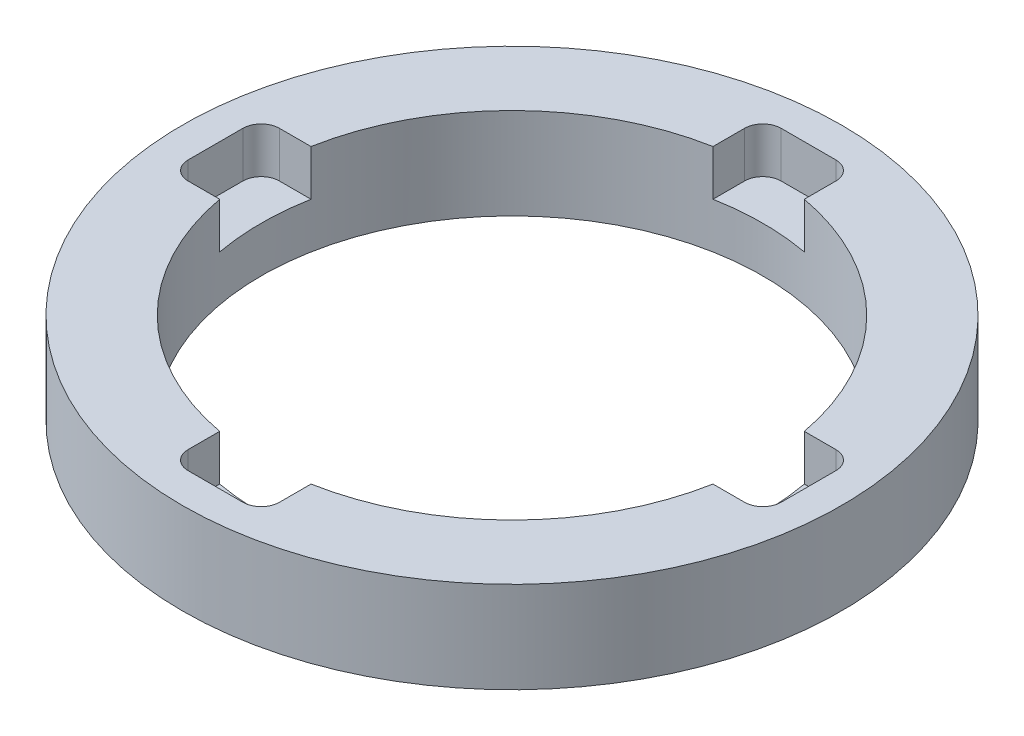
ISO-10303-21;
HEADER;
FILE_DESCRIPTION(('STEP AP214'),'2;1');
FILE_NAME('part.step','',(''),(''),'','','');
FILE_SCHEMA(('AUTOMOTIVE_DESIGN { 1 0 10303 214 1 1 1 1 }'));
ENDSEC;
DATA;
#1=APPLICATION_CONTEXT('core data for automotive mechanical design processes');
#2=APPLICATION_PROTOCOL_DEFINITION('international standard','automotive_design',2000,#1);
#3=PRODUCT_CONTEXT('',#1,'mechanical');
#4=PRODUCT('Part','Part','',(#3));
#5=PRODUCT_RELATED_PRODUCT_CATEGORY('part','',(#4));
#6=PRODUCT_DEFINITION_FORMATION('','',#4);
#7=PRODUCT_DEFINITION_CONTEXT('part definition',#1,'design');
#8=PRODUCT_DEFINITION('design','',#6,#7);
#9=PRODUCT_DEFINITION_SHAPE('','',#8);
#10=(LENGTH_UNIT() NAMED_UNIT(*) SI_UNIT(.MILLI.,.METRE.));
#11=(NAMED_UNIT(*) PLANE_ANGLE_UNIT() SI_UNIT($,.RADIAN.));
#12=(NAMED_UNIT(*) SI_UNIT($,.STERADIAN.) SOLID_ANGLE_UNIT());
#13=UNCERTAINTY_MEASURE_WITH_UNIT(LENGTH_MEASURE(1.E-05),#10,'distance_accuracy_value','');
#14=(GEOMETRIC_REPRESENTATION_CONTEXT(3) GLOBAL_UNCERTAINTY_ASSIGNED_CONTEXT((#13)) GLOBAL_UNIT_ASSIGNED_CONTEXT((#10,
#11,#12)) REPRESENTATION_CONTEXT('',''));
#15=CARTESIAN_POINT('',(0.,0.,0.));
#16=DIRECTION('',(0.,0.,1.));
#17=DIRECTION('',(1.,0.,0.));
#18=AXIS2_PLACEMENT_3D('',#15,#16,#17);
#19=CARTESIAN_POINT('',(0.,12.7,0.));
#20=DIRECTION('',(0.,1.,0.));
#21=DIRECTION('',(0.,0.,1.));
#22=AXIS2_PLACEMENT_3D('',#19,#20,#21);
#23=PLANE('',#22);
#24=DIRECTION('',(0.,0.,-1.));
#25=VECTOR('',#24,1.);
#26=CARTESIAN_POINT('',(6.35,12.7,34.3041293667395));
#27=LINE('',#26,#25);
#28=CARTESIAN_POINT('',(6.35,12.7,38.6969));
#29=VERTEX_POINT('',#28);
#30=CARTESIAN_POINT('',(6.35,12.7,34.3041293667395));
#31=VERTEX_POINT('',#30);
#32=EDGE_CURVE('E217',#29,#31,#27,.T.);
#33=ORIENTED_EDGE('',*,*,#32,.F.);
#34=CARTESIAN_POINT('',(3.81,12.7,38.6969));
#35=DIRECTION('',(0.,1.,0.));
#36=DIRECTION('',(0.,0.,-1.));
#37=AXIS2_PLACEMENT_3D('',#34,#35,#36);
#38=CIRCLE('',#37,2.54);
#39=CARTESIAN_POINT('',(3.80999999999998,12.7,41.2369));
#40=VERTEX_POINT('',#39);
#41=EDGE_CURVE('E436',#40,#29,#38,.T.);
#42=ORIENTED_EDGE('',*,*,#41,.F.);
#43=DIRECTION('',(1.,0.,0.));
#44=VECTOR('',#43,1.);
#45=CARTESIAN_POINT('',(-3.80999999999998,12.7,41.2369));
#46=LINE('',#45,#44);
#47=CARTESIAN_POINT('',(-3.80999999999998,12.7,41.2369));
#48=VERTEX_POINT('',#47);
#49=EDGE_CURVE('E430',#48,#40,#46,.T.);
#50=ORIENTED_EDGE('',*,*,#49,.F.);
#51=CARTESIAN_POINT('',(-3.81,12.7,38.6969));
#52=DIRECTION('',(0.,1.,0.));
#53=DIRECTION('',(0.,0.,-1.));
#54=AXIS2_PLACEMENT_3D('',#51,#52,#53);
#55=CIRCLE('',#54,2.54);
#56=CARTESIAN_POINT('',(-6.35,12.7,38.6969));
#57=VERTEX_POINT('',#56);
#58=EDGE_CURVE('E428',#57,#48,#55,.T.);
#59=ORIENTED_EDGE('',*,*,#58,.F.);
#60=DIRECTION('',(0.,0.,1.));
#61=VECTOR('',#60,1.);
#62=CARTESIAN_POINT('',(-6.35,12.7,34.3041293667395));
#63=LINE('',#62,#61);
#64=CARTESIAN_POINT('',(-6.35,12.7,34.3041293667395));
#65=VERTEX_POINT('',#64);
#66=EDGE_CURVE('E264',#65,#57,#63,.T.);
#67=ORIENTED_EDGE('',*,*,#66,.F.);
#68=CARTESIAN_POINT('',(0.,12.7,0.));
#69=DIRECTION('',(0.,1.,0.));
#70=DIRECTION('',(0.,0.,1.));
#71=AXIS2_PLACEMENT_3D('',#68,#69,#70);
#72=CIRCLE('',#71,34.8869);
#73=CARTESIAN_POINT('',(-34.3041293667395,12.7,6.35000000000012));
#74=VERTEX_POINT('',#73);
#75=EDGE_CURVE('E224',#74,#65,#72,.T.);
#76=ORIENTED_EDGE('',*,*,#75,.F.);
#77=DIRECTION('',(1.,0.,0.));
#78=VECTOR('',#77,1.);
#79=CARTESIAN_POINT('',(-34.3041293667395,12.7,6.35000000000012));
#80=LINE('',#79,#78);
#81=CARTESIAN_POINT('',(-38.6969,12.7,6.35000000000014));
#82=VERTEX_POINT('',#81);
#83=EDGE_CURVE('E278',#82,#74,#80,.T.);
#84=ORIENTED_EDGE('',*,*,#83,.F.);
#85=CARTESIAN_POINT('',(-38.6969,12.7,3.81000000000014));
#86=DIRECTION('',(0.,1.,0.));
#87=DIRECTION('',(1.,0.,0.));
#88=AXIS2_PLACEMENT_3D('',#85,#86,#87);
#89=CIRCLE('',#88,2.54);
#90=CARTESIAN_POINT('',(-41.2369,12.7,3.81000000000013));
#91=VERTEX_POINT('',#90);
#92=EDGE_CURVE('E303',#91,#82,#89,.T.);
#93=ORIENTED_EDGE('',*,*,#92,.F.);
#94=DIRECTION('',(0.,0.,1.));
#95=VECTOR('',#94,1.);
#96=CARTESIAN_POINT('',(-41.2369,12.7,-3.80999999999984));
#97=LINE('',#96,#95);
#98=CARTESIAN_POINT('',(-41.2369,12.7,-3.80999999999984));
#99=VERTEX_POINT('',#98);
#100=EDGE_CURVE('E300',#99,#91,#97,.T.);
#101=ORIENTED_EDGE('',*,*,#100,.F.);
#102=CARTESIAN_POINT('',(-38.6969,12.7,-3.80999999999987));
#103=DIRECTION('',(0.,1.,0.));
#104=DIRECTION('',(1.,0.,0.));
#105=AXIS2_PLACEMENT_3D('',#102,#103,#104);
#106=CIRCLE('',#105,2.54);
#107=CARTESIAN_POINT('',(-38.6969,12.7,-6.34999999999986));
#108=VERTEX_POINT('',#107);
#109=EDGE_CURVE('E296',#108,#99,#106,.T.);
#110=ORIENTED_EDGE('',*,*,#109,.F.);
#111=DIRECTION('',(-1.,0.,0.));
#112=VECTOR('',#111,1.);
#113=CARTESIAN_POINT('',(-34.3041293667395,12.7,-6.34999999999988));
#114=LINE('',#113,#112);
#115=CARTESIAN_POINT('',(-34.3041293667395,12.7,-6.34999999999988));
#116=VERTEX_POINT('',#115);
#117=EDGE_CURVE('E293',#116,#108,#114,.T.);
#118=ORIENTED_EDGE('',*,*,#117,.F.);
#119=CARTESIAN_POINT('',(-6.35,12.7,-34.3041293667395));
#120=VERTEX_POINT('',#119);
#121=EDGE_CURVE('E364',#120,#116,#72,.T.);
#122=ORIENTED_EDGE('',*,*,#121,.F.);
#123=DIRECTION('',(0.,0.,1.));
#124=VECTOR('',#123,1.);
#125=CARTESIAN_POINT('',(-6.35,12.7,-34.3041293667395));
#126=LINE('',#125,#124);
#127=CARTESIAN_POINT('',(-6.35,12.7,-38.6969));
#128=VERTEX_POINT('',#127);
#129=EDGE_CURVE('E323',#128,#120,#126,.T.);
#130=ORIENTED_EDGE('',*,*,#129,.F.);
#131=CARTESIAN_POINT('',(-3.81,12.7,-38.6969));
#132=DIRECTION('',(0.,1.,0.));
#133=DIRECTION('',(0.,0.,1.));
#134=AXIS2_PLACEMENT_3D('',#131,#132,#133);
#135=CIRCLE('',#134,2.54);
#136=CARTESIAN_POINT('',(-3.80999999999998,12.7,-41.2369));
#137=VERTEX_POINT('',#136);
#138=EDGE_CURVE('E346',#137,#128,#135,.T.);
#139=ORIENTED_EDGE('',*,*,#138,.F.);
#140=DIRECTION('',(-1.,0.,0.));
#141=VECTOR('',#140,1.);
#142=CARTESIAN_POINT('',(3.80999999999998,12.7,-41.2369));
#143=LINE('',#142,#141);
#144=CARTESIAN_POINT('',(3.80999999999998,12.7,-41.2369));
#145=VERTEX_POINT('',#144);
#146=EDGE_CURVE('E343',#145,#137,#143,.T.);
#147=ORIENTED_EDGE('',*,*,#146,.F.);
#148=CARTESIAN_POINT('',(3.81,12.7,-38.6969));
#149=DIRECTION('',(0.,1.,0.));
#150=DIRECTION('',(0.,0.,1.));
#151=AXIS2_PLACEMENT_3D('',#148,#149,#150);
#152=CIRCLE('',#151,2.54);
#153=CARTESIAN_POINT('',(6.35,12.7,-38.6969));
#154=VERTEX_POINT('',#153);
#155=EDGE_CURVE('E340',#154,#145,#152,.T.);
#156=ORIENTED_EDGE('',*,*,#155,.F.);
#157=DIRECTION('',(0.,0.,-1.));
#158=VECTOR('',#157,1.);
#159=CARTESIAN_POINT('',(6.35,12.7,-34.3041293667395));
#160=LINE('',#159,#158);
#161=CARTESIAN_POINT('',(6.35,12.7,-34.3041293667395));
#162=VERTEX_POINT('',#161);
#163=EDGE_CURVE('E309',#162,#154,#160,.T.);
#164=ORIENTED_EDGE('',*,*,#163,.F.);
#165=CARTESIAN_POINT('',(34.3041293667394,12.7,-6.35000000000036));
#166=VERTEX_POINT('',#165);
#167=EDGE_CURVE('E367',#166,#162,#72,.T.);
#168=ORIENTED_EDGE('',*,*,#167,.F.);
#169=DIRECTION('',(-1.,0.,0.));
#170=VECTOR('',#169,1.);
#171=CARTESIAN_POINT('',(34.3041293667394,12.7,-6.35000000000036));
#172=LINE('',#171,#170);
#173=CARTESIAN_POINT('',(38.6968999999999,12.7,-6.35000000000041));
#174=VERTEX_POINT('',#173);
#175=EDGE_CURVE('E235',#174,#166,#172,.T.);
#176=ORIENTED_EDGE('',*,*,#175,.F.);
#177=CARTESIAN_POINT('',(38.6969,12.7,-3.81000000000041));
#178=DIRECTION('',(0.,1.,0.));
#179=DIRECTION('',(-1.,0.,0.));
#180=AXIS2_PLACEMENT_3D('',#177,#178,#179);
#181=CIRCLE('',#180,2.54);
#182=CARTESIAN_POINT('',(41.2369,12.7,-3.81000000000041));
#183=VERTEX_POINT('',#182);
#184=EDGE_CURVE('E257',#183,#174,#181,.T.);
#185=ORIENTED_EDGE('',*,*,#184,.F.);
#186=DIRECTION('',(0.,0.,-1.));
#187=VECTOR('',#186,1.);
#188=CARTESIAN_POINT('',(41.2369,12.7,3.80999999999955));
#189=LINE('',#188,#187);
#190=CARTESIAN_POINT('',(41.2369,12.7,3.80999999999955));
#191=VERTEX_POINT('',#190);
#192=EDGE_CURVE('E254',#191,#183,#189,.T.);
#193=ORIENTED_EDGE('',*,*,#192,.F.);
#194=CARTESIAN_POINT('',(38.6969,12.7,3.8099999999996));
#195=DIRECTION('',(0.,1.,0.));
#196=DIRECTION('',(-1.,0.,0.));
#197=AXIS2_PLACEMENT_3D('',#194,#195,#196);
#198=CIRCLE('',#197,2.54);
#199=CARTESIAN_POINT('',(38.6969000000001,12.7,6.34999999999959));
#200=VERTEX_POINT('',#199);
#201=EDGE_CURVE('E251',#200,#191,#198,.T.);
#202=ORIENTED_EDGE('',*,*,#201,.F.);
#203=DIRECTION('',(1.,0.,0.));
#204=VECTOR('',#203,1.);
#205=CARTESIAN_POINT('',(34.3041293667396,12.7,6.34999999999964));
#206=LINE('',#205,#204);
#207=CARTESIAN_POINT('',(34.3041293667396,12.7,6.34999999999964));
#208=VERTEX_POINT('',#207);
#209=EDGE_CURVE('E248',#208,#200,#206,.T.);
#210=ORIENTED_EDGE('',*,*,#209,.F.);
#211=EDGE_CURVE('E371',#31,#208,#72,.T.);
#212=ORIENTED_EDGE('',*,*,#211,.F.);
#213=EDGE_LOOP('',(#33,#42,#50,#59,#67,#76,#84,#93,#101,#110,#118,#122,#130,#139,#147,#156,#164,
#168,#176,#185,#193,#202,#210,#212));
#214=FACE_BOUND('',#213,.T.);
#215=CARTESIAN_POINT('',(0.,12.7,0.));
#216=DIRECTION('',(0.,1.,0.));
#217=DIRECTION('',(0.,0.,1.));
#218=AXIS2_PLACEMENT_3D('',#215,#216,#217);
#219=CIRCLE('',#218,45.8343);
#220=CARTESIAN_POINT('',(0.,12.7,45.8343));
#221=VERTEX_POINT('',#220);
#222=EDGE_CURVE('E11',#221,#221,#219,.T.);
#223=ORIENTED_EDGE('',*,*,#222,.T.);
#224=EDGE_LOOP('',(#223));
#225=FACE_BOUND('',#224,.T.);
#226=ADVANCED_FACE('F37',(#214,#225),#23,.T.);
#227=CARTESIAN_POINT('',(0.,0.,0.));
#228=DIRECTION('',(0.,1.,0.));
#229=DIRECTION('',(0.,0.,1.));
#230=AXIS2_PLACEMENT_3D('',#227,#228,#229);
#231=PLANE('',#230);
#232=CARTESIAN_POINT('',(0.,0.,0.));
#233=DIRECTION('',(0.,1.,0.));
#234=DIRECTION('',(0.,0.,1.));
#235=AXIS2_PLACEMENT_3D('',#232,#233,#234);
#236=CIRCLE('',#235,45.8343);
#237=CARTESIAN_POINT('',(0.,0.,45.8343));
#238=VERTEX_POINT('',#237);
#239=EDGE_CURVE('E41',#238,#238,#236,.T.);
#240=ORIENTED_EDGE('',*,*,#239,.F.);
#241=EDGE_LOOP('',(#240));
#242=FACE_BOUND('',#241,.T.);
#243=CARTESIAN_POINT('',(0.,0.,0.));
#244=DIRECTION('',(0.,1.,0.));
#245=DIRECTION('',(0.,0.,1.));
#246=AXIS2_PLACEMENT_3D('',#243,#244,#245);
#247=CIRCLE('',#246,34.8869);
#248=CARTESIAN_POINT('',(0.,0.,34.8869));
#249=VERTEX_POINT('',#248);
#250=EDGE_CURVE('E353',#249,#249,#247,.T.);
#251=ORIENTED_EDGE('',*,*,#250,.T.);
#252=EDGE_LOOP('',(#251));
#253=FACE_BOUND('',#252,.T.);
#254=ADVANCED_FACE('F468',(#242,#253),#231,.F.);
#255=CARTESIAN_POINT('',(0.,12.7,0.));
#256=DIRECTION('',(0.,-1.,0.));
#257=DIRECTION('',(0.,0.,-1.));
#258=AXIS2_PLACEMENT_3D('',#255,#256,#257);
#259=CYLINDRICAL_SURFACE('',#258,45.8343);
#260=ORIENTED_EDGE('',*,*,#222,.F.);
#261=EDGE_LOOP('',(#260));
#262=FACE_BOUND('',#261,.T.);
#263=ORIENTED_EDGE('',*,*,#239,.T.);
#264=EDGE_LOOP('',(#263));
#265=FACE_BOUND('',#264,.T.);
#266=ADVANCED_FACE('F39',(#262,#265),#259,.T.);
#267=CARTESIAN_POINT('',(0.,12.7,0.));
#268=DIRECTION('',(0.,-1.,0.));
#269=DIRECTION('',(0.,0.,-1.));
#270=AXIS2_PLACEMENT_3D('',#267,#268,#269);
#271=CYLINDRICAL_SURFACE('',#270,34.8869);
#272=DIRECTION('',(0.,1.,0.));
#273=VECTOR('',#272,1.);
#274=CARTESIAN_POINT('',(6.35,6.35,34.3041293667395));
#275=LINE('',#274,#273);
#276=CARTESIAN_POINT('',(6.35,6.35,34.3041293667395));
#277=VERTEX_POINT('',#276);
#278=EDGE_CURVE('E297',#277,#31,#275,.T.);
#279=ORIENTED_EDGE('',*,*,#278,.T.);
#280=ORIENTED_EDGE('',*,*,#211,.T.);
#281=DIRECTION('',(0.,1.,0.));
#282=VECTOR('',#281,1.);
#283=CARTESIAN_POINT('',(34.3041293667396,6.35,6.34999999999964));
#284=LINE('',#283,#282);
#285=CARTESIAN_POINT('',(34.3041293667396,6.35,6.34999999999964));
#286=VERTEX_POINT('',#285);
#287=EDGE_CURVE('E247',#286,#208,#284,.T.);
#288=ORIENTED_EDGE('',*,*,#287,.F.);
#289=CARTESIAN_POINT('',(0.,6.35,0.));
#290=DIRECTION('',(0.,-1.,0.));
#291=DIRECTION('',(-1.,0.,0.));
#292=AXIS2_PLACEMENT_3D('',#289,#290,#291);
#293=CIRCLE('',#292,34.8869);
#294=CARTESIAN_POINT('',(34.3041293667394,6.35,-6.35000000000036));
#295=VERTEX_POINT('',#294);
#296=EDGE_CURVE('E232',#295,#286,#293,.T.);
#297=ORIENTED_EDGE('',*,*,#296,.F.);
#298=DIRECTION('',(0.,1.,0.));
#299=VECTOR('',#298,1.);
#300=CARTESIAN_POINT('',(34.3041293667394,6.35,-6.35000000000036));
#301=LINE('',#300,#299);
#302=EDGE_CURVE('E261',#295,#166,#301,.T.);
#303=ORIENTED_EDGE('',*,*,#302,.T.);
#304=ORIENTED_EDGE('',*,*,#167,.T.);
#305=DIRECTION('',(0.,1.,0.));
#306=VECTOR('',#305,1.);
#307=CARTESIAN_POINT('',(6.35,6.35,-34.3041293667395));
#308=LINE('',#307,#306);
#309=CARTESIAN_POINT('',(6.35,6.35,-34.3041293667395));
#310=VERTEX_POINT('',#309);
#311=EDGE_CURVE('E337',#310,#162,#308,.T.);
#312=ORIENTED_EDGE('',*,*,#311,.F.);
#313=CARTESIAN_POINT('',(0.,6.35,0.));
#314=DIRECTION('',(0.,-1.,0.));
#315=DIRECTION('',(0.,0.,1.));
#316=AXIS2_PLACEMENT_3D('',#313,#314,#315);
#317=CIRCLE('',#316,34.8869);
#318=CARTESIAN_POINT('',(-6.35,6.35,-34.3041293667395));
#319=VERTEX_POINT('',#318);
#320=EDGE_CURVE('E319',#319,#310,#317,.T.);
#321=ORIENTED_EDGE('',*,*,#320,.F.);
#322=DIRECTION('',(0.,1.,0.));
#323=VECTOR('',#322,1.);
#324=CARTESIAN_POINT('',(-6.35,6.35,-34.3041293667395));
#325=LINE('',#324,#323);
#326=EDGE_CURVE('E350',#319,#120,#325,.T.);
#327=ORIENTED_EDGE('',*,*,#326,.T.);
#328=ORIENTED_EDGE('',*,*,#121,.T.);
#329=DIRECTION('',(0.,1.,0.));
#330=VECTOR('',#329,1.);
#331=CARTESIAN_POINT('',(-34.3041293667395,6.35,-6.34999999999988));
#332=LINE('',#331,#330);
#333=CARTESIAN_POINT('',(-34.3041293667395,6.35,-6.34999999999988));
#334=VERTEX_POINT('',#333);
#335=EDGE_CURVE('E292',#334,#116,#332,.T.);
#336=ORIENTED_EDGE('',*,*,#335,.F.);
#337=CARTESIAN_POINT('',(0.,6.35,0.));
#338=DIRECTION('',(0.,-1.,0.));
#339=DIRECTION('',(1.,0.,0.));
#340=AXIS2_PLACEMENT_3D('',#337,#338,#339);
#341=CIRCLE('',#340,34.8869);
#342=CARTESIAN_POINT('',(-34.3041293667395,6.35,6.35000000000012));
#343=VERTEX_POINT('',#342);
#344=EDGE_CURVE('E274',#343,#334,#341,.T.);
#345=ORIENTED_EDGE('',*,*,#344,.F.);
#346=DIRECTION('',(0.,1.,0.));
#347=VECTOR('',#346,1.);
#348=CARTESIAN_POINT('',(-34.3041293667395,6.35,6.35000000000012));
#349=LINE('',#348,#347);
#350=EDGE_CURVE('E307',#343,#74,#349,.T.);
#351=ORIENTED_EDGE('',*,*,#350,.T.);
#352=ORIENTED_EDGE('',*,*,#75,.T.);
#353=DIRECTION('',(0.,1.,0.));
#354=VECTOR('',#353,1.);
#355=CARTESIAN_POINT('',(-6.35,6.35,34.3041293667395));
#356=LINE('',#355,#354);
#357=CARTESIAN_POINT('',(-6.35,6.35,34.3041293667395));
#358=VERTEX_POINT('',#357);
#359=EDGE_CURVE('E205',#358,#65,#356,.T.);
#360=ORIENTED_EDGE('',*,*,#359,.F.);
#361=CARTESIAN_POINT('',(0.,6.35,0.));
#362=DIRECTION('',(0.,-1.,0.));
#363=DIRECTION('',(0.,0.,-1.));
#364=AXIS2_PLACEMENT_3D('',#361,#362,#363);
#365=CIRCLE('',#364,34.8869);
#366=EDGE_CURVE('E211',#277,#358,#365,.T.);
#367=ORIENTED_EDGE('',*,*,#366,.F.);
#368=EDGE_LOOP('',(#279,#280,#288,#297,#303,#304,#312,#321,#327,#328,#336,#345,#351,#352,#360,#367));
#369=FACE_BOUND('',#368,.T.);
#370=ORIENTED_EDGE('',*,*,#250,.F.);
#371=EDGE_LOOP('',(#370));
#372=FACE_BOUND('',#371,.T.);
#373=ADVANCED_FACE('F220',(#369,#372),#271,.F.);
#374=CARTESIAN_POINT('',(-6.35,6.35,-34.3041293667395));
#375=DIRECTION('',(-1.,0.,0.));
#376=DIRECTION('',(0.,0.,1.));
#377=AXIS2_PLACEMENT_3D('',#374,#375,#376);
#378=PLANE('',#377);
#379=ORIENTED_EDGE('',*,*,#129,.T.);
#380=ORIENTED_EDGE('',*,*,#326,.F.);
#381=DIRECTION('',(0.,0.,1.));
#382=VECTOR('',#381,1.);
#383=CARTESIAN_POINT('',(-6.35,6.35,-34.3041293667395));
#384=LINE('',#383,#382);
#385=CARTESIAN_POINT('',(-6.35,6.35,-38.6969));
#386=VERTEX_POINT('',#385);
#387=EDGE_CURVE('E335',#386,#319,#384,.T.);
#388=ORIENTED_EDGE('',*,*,#387,.F.);
#389=DIRECTION('',(0.,1.,0.));
#390=VECTOR('',#389,1.);
#391=CARTESIAN_POINT('',(-6.35,6.35,-38.6969));
#392=LINE('',#391,#390);
#393=EDGE_CURVE('E354',#386,#128,#392,.T.);
#394=ORIENTED_EDGE('',*,*,#393,.T.);
#395=EDGE_LOOP('',(#379,#380,#388,#394));
#396=FACE_BOUND('',#395,.T.);
#397=ADVANCED_FACE('F406',(#396),#378,.F.);
#398=CARTESIAN_POINT('',(-3.81,6.35,-38.6969));
#399=DIRECTION('',(0.,1.,0.));
#400=DIRECTION('',(0.,0.,1.));
#401=AXIS2_PLACEMENT_3D('',#398,#399,#400);
#402=CYLINDRICAL_SURFACE('',#401,2.54);
#403=ORIENTED_EDGE('',*,*,#138,.T.);
#404=ORIENTED_EDGE('',*,*,#393,.F.);
#405=CARTESIAN_POINT('',(-3.81,6.35,-38.6969));
#406=DIRECTION('',(0.,1.,0.));
#407=DIRECTION('',(0.,0.,1.));
#408=AXIS2_PLACEMENT_3D('',#405,#406,#407);
#409=CIRCLE('',#408,2.54);
#410=CARTESIAN_POINT('',(-3.80999999999998,6.35,-41.2369));
#411=VERTEX_POINT('',#410);
#412=EDGE_CURVE('E332',#411,#386,#409,.T.);
#413=ORIENTED_EDGE('',*,*,#412,.F.);
#414=DIRECTION('',(0.,1.,0.));
#415=VECTOR('',#414,1.);
#416=CARTESIAN_POINT('',(-3.80999999999998,6.35,-41.2369));
#417=LINE('',#416,#415);
#418=EDGE_CURVE('E356',#411,#137,#417,.T.);
#419=ORIENTED_EDGE('',*,*,#418,.T.);
#420=EDGE_LOOP('',(#403,#404,#413,#419));
#421=FACE_BOUND('',#420,.T.);
#422=ADVANCED_FACE('F486',(#421),#402,.F.);
#423=CARTESIAN_POINT('',(3.80999999999998,6.35,-41.2369));
#424=DIRECTION('',(0.,0.,-1.));
#425=DIRECTION('',(-1.,0.,0.));
#426=AXIS2_PLACEMENT_3D('',#423,#424,#425);
#427=PLANE('',#426);
#428=ORIENTED_EDGE('',*,*,#146,.T.);
#429=ORIENTED_EDGE('',*,*,#418,.F.);
#430=DIRECTION('',(-1.,0.,0.));
#431=VECTOR('',#430,1.);
#432=CARTESIAN_POINT('',(3.80999999999998,6.35,-41.2369));
#433=LINE('',#432,#431);
#434=CARTESIAN_POINT('',(3.80999999999998,6.35,-41.2369));
#435=VERTEX_POINT('',#434);
#436=EDGE_CURVE('E329',#435,#411,#433,.T.);
#437=ORIENTED_EDGE('',*,*,#436,.F.);
#438=DIRECTION('',(0.,1.,0.));
#439=VECTOR('',#438,1.);
#440=CARTESIAN_POINT('',(3.80999999999998,6.35,-41.2369));
#441=LINE('',#440,#439);
#442=EDGE_CURVE('E358',#435,#145,#441,.T.);
#443=ORIENTED_EDGE('',*,*,#442,.T.);
#444=EDGE_LOOP('',(#428,#429,#437,#443));
#445=FACE_BOUND('',#444,.T.);
#446=ADVANCED_FACE('F482',(#445),#427,.F.);
#447=CARTESIAN_POINT('',(3.81,6.35,-38.6969));
#448=DIRECTION('',(0.,1.,0.));
#449=DIRECTION('',(0.,0.,1.));
#450=AXIS2_PLACEMENT_3D('',#447,#448,#449);
#451=CYLINDRICAL_SURFACE('',#450,2.54);
#452=ORIENTED_EDGE('',*,*,#155,.T.);
#453=ORIENTED_EDGE('',*,*,#442,.F.);
#454=CARTESIAN_POINT('',(3.81,6.35,-38.6969));
#455=DIRECTION('',(0.,1.,0.));
#456=DIRECTION('',(0.,0.,1.));
#457=AXIS2_PLACEMENT_3D('',#454,#455,#456);
#458=CIRCLE('',#457,2.54);
#459=CARTESIAN_POINT('',(6.35,6.35,-38.6969));
#460=VERTEX_POINT('',#459);
#461=EDGE_CURVE('E326',#460,#435,#458,.T.);
#462=ORIENTED_EDGE('',*,*,#461,.F.);
#463=DIRECTION('',(0.,1.,0.));
#464=VECTOR('',#463,1.);
#465=CARTESIAN_POINT('',(6.35,6.35,-38.6969));
#466=LINE('',#465,#464);
#467=EDGE_CURVE('E360',#460,#154,#466,.T.);
#468=ORIENTED_EDGE('',*,*,#467,.T.);
#469=EDGE_LOOP('',(#452,#453,#462,#468));
#470=FACE_BOUND('',#469,.T.);
#471=ADVANCED_FACE('F479',(#470),#451,.F.);
#472=CARTESIAN_POINT('',(6.35,6.35,-34.3041293667395));
#473=DIRECTION('',(1.,0.,0.));
#474=DIRECTION('',(0.,0.,-1.));
#475=AXIS2_PLACEMENT_3D('',#472,#473,#474);
#476=PLANE('',#475);
#477=ORIENTED_EDGE('',*,*,#163,.T.);
#478=ORIENTED_EDGE('',*,*,#467,.F.);
#479=DIRECTION('',(0.,0.,-1.));
#480=VECTOR('',#479,1.);
#481=CARTESIAN_POINT('',(6.35,6.35,-34.3041293667395));
#482=LINE('',#481,#480);
#483=EDGE_CURVE('E322',#310,#460,#482,.T.);
#484=ORIENTED_EDGE('',*,*,#483,.F.);
#485=ORIENTED_EDGE('',*,*,#311,.T.);
#486=EDGE_LOOP('',(#477,#478,#484,#485));
#487=FACE_BOUND('',#486,.T.);
#488=ADVANCED_FACE('F396',(#487),#476,.F.);
#489=CARTESIAN_POINT('',(0.,6.35,0.));
#490=DIRECTION('',(0.,1.,0.));
#491=DIRECTION('',(0.,0.,1.));
#492=AXIS2_PLACEMENT_3D('',#489,#490,#491);
#493=PLANE('',#492);
#494=ORIENTED_EDGE('',*,*,#320,.T.);
#495=ORIENTED_EDGE('',*,*,#483,.T.);
#496=ORIENTED_EDGE('',*,*,#461,.T.);
#497=ORIENTED_EDGE('',*,*,#436,.T.);
#498=ORIENTED_EDGE('',*,*,#412,.T.);
#499=ORIENTED_EDGE('',*,*,#387,.T.);
#500=EDGE_LOOP('',(#494,#495,#496,#497,#498,#499));
#501=FACE_BOUND('',#500,.T.);
#502=ADVANCED_FACE('F402',(#501),#493,.T.);
#503=CARTESIAN_POINT('',(-34.3041293667395,6.35,6.35000000000012));
#504=DIRECTION('',(0.,0.,1.));
#505=DIRECTION('',(1.,0.,0.));
#506=AXIS2_PLACEMENT_3D('',#503,#504,#505);
#507=PLANE('',#506);
#508=ORIENTED_EDGE('',*,*,#83,.T.);
#509=ORIENTED_EDGE('',*,*,#350,.F.);
#510=DIRECTION('',(1.,0.,0.));
#511=VECTOR('',#510,1.);
#512=CARTESIAN_POINT('',(-34.3041293667395,6.35,6.35000000000012));
#513=LINE('',#512,#511);
#514=CARTESIAN_POINT('',(-38.6969,6.35,6.35000000000014));
#515=VERTEX_POINT('',#514);
#516=EDGE_CURVE('E290',#515,#343,#513,.T.);
#517=ORIENTED_EDGE('',*,*,#516,.F.);
#518=DIRECTION('',(0.,1.,0.));
#519=VECTOR('',#518,1.);
#520=CARTESIAN_POINT('',(-38.6969,6.35,6.35000000000014));
#521=LINE('',#520,#519);
#522=EDGE_CURVE('E310',#515,#82,#521,.T.);
#523=ORIENTED_EDGE('',*,*,#522,.T.);
#524=EDGE_LOOP('',(#508,#509,#517,#523));
#525=FACE_BOUND('',#524,.T.);
#526=ADVANCED_FACE('F422',(#525),#507,.F.);
#527=CARTESIAN_POINT('',(-38.6969,6.35,3.81000000000014));
#528=DIRECTION('',(0.,1.,0.));
#529=DIRECTION('',(0.,0.,1.));
#530=AXIS2_PLACEMENT_3D('',#527,#528,#529);
#531=CYLINDRICAL_SURFACE('',#530,2.54);
#532=ORIENTED_EDGE('',*,*,#92,.T.);
#533=ORIENTED_EDGE('',*,*,#522,.F.);
#534=CARTESIAN_POINT('',(-38.6969,6.35,3.81000000000014));
#535=DIRECTION('',(0.,1.,0.));
#536=DIRECTION('',(1.,0.,0.));
#537=AXIS2_PLACEMENT_3D('',#534,#535,#536);
#538=CIRCLE('',#537,2.54);
#539=CARTESIAN_POINT('',(-41.2369,6.35,3.81000000000013));
#540=VERTEX_POINT('',#539);
#541=EDGE_CURVE('E287',#540,#515,#538,.T.);
#542=ORIENTED_EDGE('',*,*,#541,.F.);
#543=DIRECTION('',(0.,1.,0.));
#544=VECTOR('',#543,1.);
#545=CARTESIAN_POINT('',(-41.2369,6.35,3.81000000000013));
#546=LINE('',#545,#544);
#547=EDGE_CURVE('E312',#540,#91,#546,.T.);
#548=ORIENTED_EDGE('',*,*,#547,.T.);
#549=EDGE_LOOP('',(#532,#533,#542,#548));
#550=FACE_BOUND('',#549,.T.);
#551=ADVANCED_FACE('F504',(#550),#531,.F.);
#552=CARTESIAN_POINT('',(-41.2369,6.35,-3.80999999999984));
#553=DIRECTION('',(-1.,0.,0.));
#554=DIRECTION('',(0.,0.,1.));
#555=AXIS2_PLACEMENT_3D('',#552,#553,#554);
#556=PLANE('',#555);
#557=ORIENTED_EDGE('',*,*,#100,.T.);
#558=ORIENTED_EDGE('',*,*,#547,.F.);
#559=DIRECTION('',(0.,0.,1.));
#560=VECTOR('',#559,1.);
#561=CARTESIAN_POINT('',(-41.2369,6.35,-3.80999999999984));
#562=LINE('',#561,#560);
#563=CARTESIAN_POINT('',(-41.2369,6.35,-3.80999999999984));
#564=VERTEX_POINT('',#563);
#565=EDGE_CURVE('E284',#564,#540,#562,.T.);
#566=ORIENTED_EDGE('',*,*,#565,.F.);
#567=DIRECTION('',(0.,1.,0.));
#568=VECTOR('',#567,1.);
#569=CARTESIAN_POINT('',(-41.2369,6.35,-3.80999999999984));
#570=LINE('',#569,#568);
#571=EDGE_CURVE('E314',#564,#99,#570,.T.);
#572=ORIENTED_EDGE('',*,*,#571,.T.);
#573=EDGE_LOOP('',(#557,#558,#566,#572));
#574=FACE_BOUND('',#573,.T.);
#575=ADVANCED_FACE('F500',(#574),#556,.F.);
#576=CARTESIAN_POINT('',(-38.6969,6.35,-3.80999999999987));
#577=DIRECTION('',(0.,1.,0.));
#578=DIRECTION('',(0.,0.,1.));
#579=AXIS2_PLACEMENT_3D('',#576,#577,#578);
#580=CYLINDRICAL_SURFACE('',#579,2.54);
#581=ORIENTED_EDGE('',*,*,#109,.T.);
#582=ORIENTED_EDGE('',*,*,#571,.F.);
#583=CARTESIAN_POINT('',(-38.6969,6.35,-3.80999999999987));
#584=DIRECTION('',(0.,1.,0.));
#585=DIRECTION('',(1.,0.,0.));
#586=AXIS2_PLACEMENT_3D('',#583,#584,#585);
#587=CIRCLE('',#586,2.54);
#588=CARTESIAN_POINT('',(-38.6969,6.35,-6.34999999999986));
#589=VERTEX_POINT('',#588);
#590=EDGE_CURVE('E281',#589,#564,#587,.T.);
#591=ORIENTED_EDGE('',*,*,#590,.F.);
#592=DIRECTION('',(0.,1.,0.));
#593=VECTOR('',#592,1.);
#594=CARTESIAN_POINT('',(-38.6969,6.35,-6.34999999999986));
#595=LINE('',#594,#593);
#596=EDGE_CURVE('E316',#589,#108,#595,.T.);
#597=ORIENTED_EDGE('',*,*,#596,.T.);
#598=EDGE_LOOP('',(#581,#582,#591,#597));
#599=FACE_BOUND('',#598,.T.);
#600=ADVANCED_FACE('F497',(#599),#580,.F.);
#601=CARTESIAN_POINT('',(-34.3041293667395,6.35,-6.34999999999988));
#602=DIRECTION('',(0.,0.,-1.));
#603=DIRECTION('',(-1.,0.,0.));
#604=AXIS2_PLACEMENT_3D('',#601,#602,#603);
#605=PLANE('',#604);
#606=ORIENTED_EDGE('',*,*,#117,.T.);
#607=ORIENTED_EDGE('',*,*,#596,.F.);
#608=DIRECTION('',(-1.,0.,0.));
#609=VECTOR('',#608,1.);
#610=CARTESIAN_POINT('',(-34.3041293667395,6.35,-6.34999999999988));
#611=LINE('',#610,#609);
#612=EDGE_CURVE('E277',#334,#589,#611,.T.);
#613=ORIENTED_EDGE('',*,*,#612,.F.);
#614=ORIENTED_EDGE('',*,*,#335,.T.);
#615=EDGE_LOOP('',(#606,#607,#613,#614));
#616=FACE_BOUND('',#615,.T.);
#617=ADVANCED_FACE('F414',(#616),#605,.F.);
#618=CARTESIAN_POINT('',(0.,6.35,0.));
#619=DIRECTION('',(0.,1.,0.));
#620=DIRECTION('',(1.,0.,0.));
#621=AXIS2_PLACEMENT_3D('',#618,#619,#620);
#622=PLANE('',#621);
#623=ORIENTED_EDGE('',*,*,#344,.T.);
#624=ORIENTED_EDGE('',*,*,#612,.T.);
#625=ORIENTED_EDGE('',*,*,#590,.T.);
#626=ORIENTED_EDGE('',*,*,#565,.T.);
#627=ORIENTED_EDGE('',*,*,#541,.T.);
#628=ORIENTED_EDGE('',*,*,#516,.T.);
#629=EDGE_LOOP('',(#623,#624,#625,#626,#627,#628));
#630=FACE_BOUND('',#629,.T.);
#631=ADVANCED_FACE('F417',(#630),#622,.T.);
#632=CARTESIAN_POINT('',(34.3041293667394,6.35,-6.35000000000036));
#633=DIRECTION('',(0.,0.,-1.));
#634=DIRECTION('',(-1.,0.,0.));
#635=AXIS2_PLACEMENT_3D('',#632,#633,#634);
#636=PLANE('',#635);
#637=ORIENTED_EDGE('',*,*,#175,.T.);
#638=ORIENTED_EDGE('',*,*,#302,.F.);
#639=DIRECTION('',(-1.,0.,0.));
#640=VECTOR('',#639,1.);
#641=CARTESIAN_POINT('',(34.3041293667394,6.35,-6.35000000000036));
#642=LINE('',#641,#640);
#643=CARTESIAN_POINT('',(38.6968999999999,6.35,-6.35000000000041));
#644=VERTEX_POINT('',#643);
#645=EDGE_CURVE('E60',#644,#295,#642,.T.);
#646=ORIENTED_EDGE('',*,*,#645,.F.);
#647=DIRECTION('',(0.,1.,0.));
#648=VECTOR('',#647,1.);
#649=CARTESIAN_POINT('',(38.6968999999999,6.35,-6.35000000000041));
#650=LINE('',#649,#648);
#651=EDGE_CURVE('E265',#644,#174,#650,.T.);
#652=ORIENTED_EDGE('',*,*,#651,.T.);
#653=EDGE_LOOP('',(#637,#638,#646,#652));
#654=FACE_BOUND('',#653,.T.);
#655=ADVANCED_FACE('F513',(#654),#636,.F.);
#656=CARTESIAN_POINT('',(38.6969,6.35,-3.81000000000041));
#657=DIRECTION('',(0.,1.,0.));
#658=DIRECTION('',(0.,0.,1.));
#659=AXIS2_PLACEMENT_3D('',#656,#657,#658);
#660=CYLINDRICAL_SURFACE('',#659,2.54);
#661=ORIENTED_EDGE('',*,*,#184,.T.);
#662=ORIENTED_EDGE('',*,*,#651,.F.);
#663=CARTESIAN_POINT('',(38.6969,6.35,-3.81000000000041));
#664=DIRECTION('',(0.,1.,0.));
#665=DIRECTION('',(-1.,0.,0.));
#666=AXIS2_PLACEMENT_3D('',#663,#664,#665);
#667=CIRCLE('',#666,2.54);
#668=CARTESIAN_POINT('',(41.2369,6.35,-3.81000000000041));
#669=VERTEX_POINT('',#668);
#670=EDGE_CURVE('E244',#669,#644,#667,.T.);
#671=ORIENTED_EDGE('',*,*,#670,.F.);
#672=DIRECTION('',(0.,1.,0.));
#673=VECTOR('',#672,1.);
#674=CARTESIAN_POINT('',(41.2369,6.35,-3.81000000000041));
#675=LINE('',#674,#673);
#676=EDGE_CURVE('E267',#669,#183,#675,.T.);
#677=ORIENTED_EDGE('',*,*,#676,.T.);
#678=EDGE_LOOP('',(#661,#662,#671,#677));
#679=FACE_BOUND('',#678,.T.);
#680=ADVANCED_FACE('F523',(#679),#660,.F.);
#681=CARTESIAN_POINT('',(41.2369,6.35,3.80999999999955));
#682=DIRECTION('',(1.,0.,0.));
#683=DIRECTION('',(0.,0.,-1.));
#684=AXIS2_PLACEMENT_3D('',#681,#682,#683);
#685=PLANE('',#684);
#686=ORIENTED_EDGE('',*,*,#192,.T.);
#687=ORIENTED_EDGE('',*,*,#676,.F.);
#688=DIRECTION('',(0.,0.,-1.));
#689=VECTOR('',#688,1.);
#690=CARTESIAN_POINT('',(41.2369,6.35,3.80999999999955));
#691=LINE('',#690,#689);
#692=CARTESIAN_POINT('',(41.2369,6.35,3.80999999999955));
#693=VERTEX_POINT('',#692);
#694=EDGE_CURVE('E241',#693,#669,#691,.T.);
#695=ORIENTED_EDGE('',*,*,#694,.F.);
#696=DIRECTION('',(0.,1.,0.));
#697=VECTOR('',#696,1.);
#698=CARTESIAN_POINT('',(41.2369,6.35,3.80999999999955));
#699=LINE('',#698,#697);
#700=EDGE_CURVE('E269',#693,#191,#699,.T.);
#701=ORIENTED_EDGE('',*,*,#700,.T.);
#702=EDGE_LOOP('',(#686,#687,#695,#701));
#703=FACE_BOUND('',#702,.T.);
#704=ADVANCED_FACE('F519',(#703),#685,.F.);
#705=CARTESIAN_POINT('',(38.6969,6.35,3.8099999999996));
#706=DIRECTION('',(0.,1.,0.));
#707=DIRECTION('',(0.,0.,1.));
#708=AXIS2_PLACEMENT_3D('',#705,#706,#707);
#709=CYLINDRICAL_SURFACE('',#708,2.54);
#710=ORIENTED_EDGE('',*,*,#201,.T.);
#711=ORIENTED_EDGE('',*,*,#700,.F.);
#712=CARTESIAN_POINT('',(38.6969,6.35,3.8099999999996));
#713=DIRECTION('',(0.,1.,0.));
#714=DIRECTION('',(-1.,0.,0.));
#715=AXIS2_PLACEMENT_3D('',#712,#713,#714);
#716=CIRCLE('',#715,2.54);
#717=CARTESIAN_POINT('',(38.6969000000001,6.35,6.34999999999959));
#718=VERTEX_POINT('',#717);
#719=EDGE_CURVE('E238',#718,#693,#716,.T.);
#720=ORIENTED_EDGE('',*,*,#719,.F.);
#721=DIRECTION('',(0.,1.,0.));
#722=VECTOR('',#721,1.);
#723=CARTESIAN_POINT('',(38.6969000000001,6.35,6.34999999999959));
#724=LINE('',#723,#722);
#725=EDGE_CURVE('E271',#718,#200,#724,.T.);
#726=ORIENTED_EDGE('',*,*,#725,.T.);
#727=EDGE_LOOP('',(#710,#711,#720,#726));
#728=FACE_BOUND('',#727,.T.);
#729=ADVANCED_FACE('F516',(#728),#709,.F.);
#730=CARTESIAN_POINT('',(34.3041293667396,6.35,6.34999999999964));
#731=DIRECTION('',(0.,0.,1.));
#732=DIRECTION('',(1.,0.,0.));
#733=AXIS2_PLACEMENT_3D('',#730,#731,#732);
#734=PLANE('',#733);
#735=ORIENTED_EDGE('',*,*,#209,.T.);
#736=ORIENTED_EDGE('',*,*,#725,.F.);
#737=DIRECTION('',(1.,0.,0.));
#738=VECTOR('',#737,1.);
#739=CARTESIAN_POINT('',(34.3041293667396,6.35,6.34999999999964));
#740=LINE('',#739,#738);
#741=EDGE_CURVE('E234',#286,#718,#740,.T.);
#742=ORIENTED_EDGE('',*,*,#741,.F.);
#743=ORIENTED_EDGE('',*,*,#287,.T.);
#744=EDGE_LOOP('',(#735,#736,#742,#743));
#745=FACE_BOUND('',#744,.T.);
#746=ADVANCED_FACE('F386',(#745),#734,.F.);
#747=CARTESIAN_POINT('',(0.,6.35,0.));
#748=DIRECTION('',(0.,1.,0.));
#749=DIRECTION('',(-1.,0.,0.));
#750=AXIS2_PLACEMENT_3D('',#747,#748,#749);
#751=PLANE('',#750);
#752=ORIENTED_EDGE('',*,*,#296,.T.);
#753=ORIENTED_EDGE('',*,*,#741,.T.);
#754=ORIENTED_EDGE('',*,*,#719,.T.);
#755=ORIENTED_EDGE('',*,*,#694,.T.);
#756=ORIENTED_EDGE('',*,*,#670,.T.);
#757=ORIENTED_EDGE('',*,*,#645,.T.);
#758=EDGE_LOOP('',(#752,#753,#754,#755,#756,#757));
#759=FACE_BOUND('',#758,.T.);
#760=ADVANCED_FACE('F388',(#759),#751,.T.);
#761=CARTESIAN_POINT('',(6.35,6.35,34.3041293667395));
#762=DIRECTION('',(1.,0.,0.));
#763=DIRECTION('',(0.,0.,-1.));
#764=AXIS2_PLACEMENT_3D('',#761,#762,#763);
#765=PLANE('',#764);
#766=ORIENTED_EDGE('',*,*,#32,.T.);
#767=ORIENTED_EDGE('',*,*,#278,.F.);
#768=DIRECTION('',(0.,0.,-1.));
#769=VECTOR('',#768,1.);
#770=CARTESIAN_POINT('',(6.35,6.35,34.3041293667395));
#771=LINE('',#770,#769);
#772=CARTESIAN_POINT('',(6.35,6.35,38.6969));
#773=VERTEX_POINT('',#772);
#774=EDGE_CURVE('E52',#773,#277,#771,.T.);
#775=ORIENTED_EDGE('',*,*,#774,.F.);
#776=DIRECTION('',(0.,1.,0.));
#777=VECTOR('',#776,1.);
#778=CARTESIAN_POINT('',(6.35,6.35,38.6969));
#779=LINE('',#778,#777);
#780=EDGE_CURVE('E441',#773,#29,#779,.T.);
#781=ORIENTED_EDGE('',*,*,#780,.T.);
#782=EDGE_LOOP('',(#766,#767,#775,#781));
#783=FACE_BOUND('',#782,.T.);
#784=ADVANCED_FACE('F457',(#783),#765,.F.);
#785=CARTESIAN_POINT('',(3.81,6.35,38.6969));
#786=DIRECTION('',(0.,1.,0.));
#787=DIRECTION('',(0.,0.,1.));
#788=AXIS2_PLACEMENT_3D('',#785,#786,#787);
#789=CYLINDRICAL_SURFACE('',#788,2.54);
#790=ORIENTED_EDGE('',*,*,#41,.T.);
#791=ORIENTED_EDGE('',*,*,#780,.F.);
#792=CARTESIAN_POINT('',(3.81,6.35,38.6969));
#793=DIRECTION('',(0.,1.,0.));
#794=DIRECTION('',(0.,0.,-1.));
#795=AXIS2_PLACEMENT_3D('',#792,#793,#794);
#796=CIRCLE('',#795,2.54);
#797=CARTESIAN_POINT('',(3.80999999999998,6.35,41.2369));
#798=VERTEX_POINT('',#797);
#799=EDGE_CURVE('E228',#798,#773,#796,.T.);
#800=ORIENTED_EDGE('',*,*,#799,.F.);
#801=DIRECTION('',(0.,1.,0.));
#802=VECTOR('',#801,1.);
#803=CARTESIAN_POINT('',(3.80999999999998,6.35,41.2369));
#804=LINE('',#803,#802);
#805=EDGE_CURVE('E443',#798,#40,#804,.T.);
#806=ORIENTED_EDGE('',*,*,#805,.T.);
#807=EDGE_LOOP('',(#790,#791,#800,#806));
#808=FACE_BOUND('',#807,.T.);
#809=ADVANCED_FACE('F452',(#808),#789,.F.);
#810=CARTESIAN_POINT('',(-3.80999999999998,6.35,41.2369));
#811=DIRECTION('',(0.,0.,1.));
#812=DIRECTION('',(1.,0.,0.));
#813=AXIS2_PLACEMENT_3D('',#810,#811,#812);
#814=PLANE('',#813);
#815=ORIENTED_EDGE('',*,*,#49,.T.);
#816=ORIENTED_EDGE('',*,*,#805,.F.);
#817=DIRECTION('',(1.,0.,0.));
#818=VECTOR('',#817,1.);
#819=CARTESIAN_POINT('',(-3.80999999999998,6.35,41.2369));
#820=LINE('',#819,#818);
#821=CARTESIAN_POINT('',(-3.80999999999998,6.35,41.2369));
#822=VERTEX_POINT('',#821);
#823=EDGE_CURVE('E448',#822,#798,#820,.T.);
#824=ORIENTED_EDGE('',*,*,#823,.F.);
#825=DIRECTION('',(0.,1.,0.));
#826=VECTOR('',#825,1.);
#827=CARTESIAN_POINT('',(-3.80999999999998,6.35,41.2369));
#828=LINE('',#827,#826);
#829=EDGE_CURVE('E226',#822,#48,#828,.T.);
#830=ORIENTED_EDGE('',*,*,#829,.T.);
#831=EDGE_LOOP('',(#815,#816,#824,#830));
#832=FACE_BOUND('',#831,.T.);
#833=ADVANCED_FACE('F446',(#832),#814,.F.);
#834=CARTESIAN_POINT('',(-3.81,6.35,38.6969));
#835=DIRECTION('',(0.,1.,0.));
#836=DIRECTION('',(0.,0.,1.));
#837=AXIS2_PLACEMENT_3D('',#834,#835,#836);
#838=CYLINDRICAL_SURFACE('',#837,2.54);
#839=ORIENTED_EDGE('',*,*,#58,.T.);
#840=ORIENTED_EDGE('',*,*,#829,.F.);
#841=CARTESIAN_POINT('',(-3.81,6.35,38.6969));
#842=DIRECTION('',(0.,1.,0.));
#843=DIRECTION('',(0.,0.,-1.));
#844=AXIS2_PLACEMENT_3D('',#841,#842,#843);
#845=CIRCLE('',#844,2.54);
#846=CARTESIAN_POINT('',(-6.35,6.35,38.6969));
#847=VERTEX_POINT('',#846);
#848=EDGE_CURVE('E210',#847,#822,#845,.T.);
#849=ORIENTED_EDGE('',*,*,#848,.F.);
#850=DIRECTION('',(0.,1.,0.));
#851=VECTOR('',#850,1.);
#852=CARTESIAN_POINT('',(-6.35,6.35,38.6969));
#853=LINE('',#852,#851);
#854=EDGE_CURVE('E207',#847,#57,#853,.T.);
#855=ORIENTED_EDGE('',*,*,#854,.T.);
#856=EDGE_LOOP('',(#839,#840,#849,#855));
#857=FACE_BOUND('',#856,.T.);
#858=ADVANCED_FACE('F450',(#857),#838,.F.);
#859=CARTESIAN_POINT('',(-6.35,6.35,34.3041293667395));
#860=DIRECTION('',(-1.,0.,0.));
#861=DIRECTION('',(0.,0.,1.));
#862=AXIS2_PLACEMENT_3D('',#859,#860,#861);
#863=PLANE('',#862);
#864=ORIENTED_EDGE('',*,*,#66,.T.);
#865=ORIENTED_EDGE('',*,*,#854,.F.);
#866=DIRECTION('',(0.,0.,1.));
#867=VECTOR('',#866,1.);
#868=CARTESIAN_POINT('',(-6.35,6.35,34.3041293667395));
#869=LINE('',#868,#867);
#870=EDGE_CURVE('E201',#358,#847,#869,.T.);
#871=ORIENTED_EDGE('',*,*,#870,.F.);
#872=ORIENTED_EDGE('',*,*,#359,.T.);
#873=EDGE_LOOP('',(#864,#865,#871,#872));
#874=FACE_BOUND('',#873,.T.);
#875=ADVANCED_FACE('F203',(#874),#863,.F.);
#876=CARTESIAN_POINT('',(0.,6.35,0.));
#877=DIRECTION('',(0.,1.,0.));
#878=DIRECTION('',(0.,0.,-1.));
#879=AXIS2_PLACEMENT_3D('',#876,#877,#878);
#880=PLANE('',#879);
#881=ORIENTED_EDGE('',*,*,#366,.T.);
#882=ORIENTED_EDGE('',*,*,#870,.T.);
#883=ORIENTED_EDGE('',*,*,#848,.T.);
#884=ORIENTED_EDGE('',*,*,#823,.T.);
#885=ORIENTED_EDGE('',*,*,#799,.T.);
#886=ORIENTED_EDGE('',*,*,#774,.T.);
#887=EDGE_LOOP('',(#881,#882,#883,#884,#885,#886));
#888=FACE_BOUND('',#887,.T.);
#889=ADVANCED_FACE('F214',(#888),#880,.T.);
#890=CLOSED_SHELL('',(#226,#254,#266,#373,#397,#422,#446,#471,#488,#502,#526,#551,#575,#600,
#617,#631,#655,#680,#704,#729,#746,#760,#784,#809,#833,#858,#875,#889));
#891=MANIFOLD_SOLID_BREP('B2',#890);
#892=ADVANCED_BREP_SHAPE_REPRESENTATION('',(#18,#891),#14);
#893=SHAPE_DEFINITION_REPRESENTATION(#9,#892);
ENDSEC;
END-ISO-10303-21;
